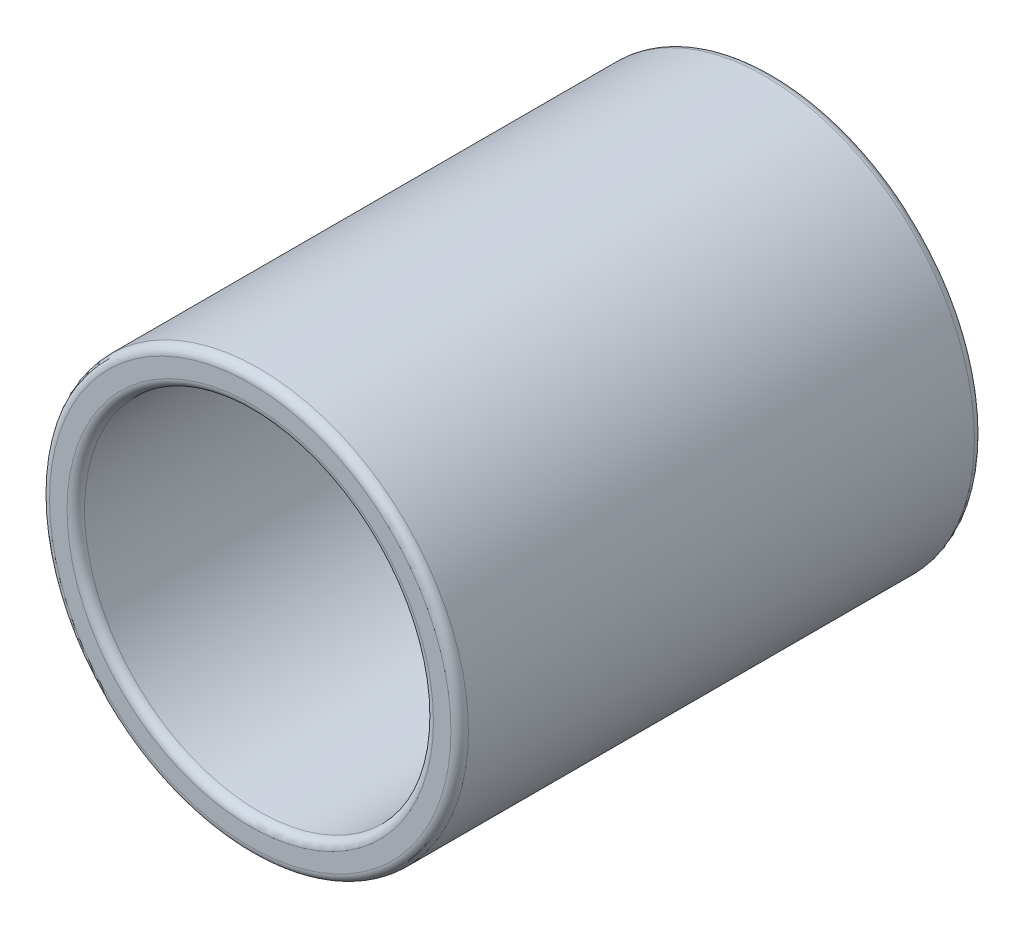
ISO-10303-21;
HEADER;
FILE_DESCRIPTION(('STEP AP214'),'2;1');
FILE_NAME('part.step','',(''),(''),'','','');
FILE_SCHEMA(('AUTOMOTIVE_DESIGN { 1 0 10303 214 1 1 1 1 }'));
ENDSEC;
DATA;
#1=APPLICATION_CONTEXT('core data for automotive mechanical design processes');
#2=APPLICATION_PROTOCOL_DEFINITION('international standard','automotive_design',2000,#1);
#3=PRODUCT_CONTEXT('',#1,'mechanical');
#4=PRODUCT('Part','Part','',(#3));
#5=PRODUCT_RELATED_PRODUCT_CATEGORY('part','',(#4));
#6=PRODUCT_DEFINITION_FORMATION('','',#4);
#7=PRODUCT_DEFINITION_CONTEXT('part definition',#1,'design');
#8=PRODUCT_DEFINITION('design','',#6,#7);
#9=PRODUCT_DEFINITION_SHAPE('','',#8);
#10=(LENGTH_UNIT() NAMED_UNIT(*) SI_UNIT(.MILLI.,.METRE.));
#11=(NAMED_UNIT(*) PLANE_ANGLE_UNIT() SI_UNIT($,.RADIAN.));
#12=(NAMED_UNIT(*) SI_UNIT($,.STERADIAN.) SOLID_ANGLE_UNIT());
#13=UNCERTAINTY_MEASURE_WITH_UNIT(LENGTH_MEASURE(1.E-05),#10,'distance_accuracy_value','');
#14=(GEOMETRIC_REPRESENTATION_CONTEXT(3) GLOBAL_UNCERTAINTY_ASSIGNED_CONTEXT((#13)) GLOBAL_UNIT_ASSIGNED_CONTEXT((#10,
#11,#12)) REPRESENTATION_CONTEXT('',''));
#15=CARTESIAN_POINT('',(0.,0.,0.));
#16=DIRECTION('',(0.,0.,1.));
#17=DIRECTION('',(1.,0.,0.));
#18=AXIS2_PLACEMENT_3D('',#15,#16,#17);
#19=CARTESIAN_POINT('',(0.,0.,30.));
#20=DIRECTION('',(0.,0.,1.));
#21=DIRECTION('',(1.,0.,0.));
#22=AXIS2_PLACEMENT_3D('',#19,#20,#21);
#23=PLANE('',#22);
#24=CARTESIAN_POINT('',(0.,0.,30.));
#25=DIRECTION('',(0.,0.,1.));
#26=DIRECTION('',(1.,0.,0.));
#27=AXIS2_PLACEMENT_3D('',#24,#25,#26);
#28=CIRCLE('',#27,10.5);
#29=CARTESIAN_POINT('',(10.5,0.,30.));
#30=VERTEX_POINT('',#29);
#31=EDGE_CURVE('E54',#30,#30,#28,.F.);
#32=ORIENTED_EDGE('',*,*,#31,.T.);
#33=EDGE_LOOP('',(#32));
#34=FACE_BOUND('',#33,.T.);
#35=CARTESIAN_POINT('',(0.,0.,30.));
#36=DIRECTION('',(0.,0.,1.));
#37=DIRECTION('',(1.,0.,0.));
#38=AXIS2_PLACEMENT_3D('',#35,#36,#37);
#39=CIRCLE('',#38,11.5);
#40=CARTESIAN_POINT('',(11.5,0.,30.));
#41=VERTEX_POINT('',#40);
#42=EDGE_CURVE('E59',#41,#41,#39,.T.);
#43=ORIENTED_EDGE('',*,*,#42,.T.);
#44=EDGE_LOOP('',(#43));
#45=FACE_BOUND('',#44,.T.);
#46=ADVANCED_FACE('F34',(#34,#45),#23,.T.);
#47=CARTESIAN_POINT('',(0.,0.,0.));
#48=DIRECTION('',(0.,0.,1.));
#49=DIRECTION('',(1.,0.,0.));
#50=AXIS2_PLACEMENT_3D('',#47,#48,#49);
#51=PLANE('',#50);
#52=CARTESIAN_POINT('',(0.,0.,0.));
#53=DIRECTION('',(0.,0.,1.));
#54=DIRECTION('',(1.,0.,0.));
#55=AXIS2_PLACEMENT_3D('',#52,#53,#54);
#56=CIRCLE('',#55,10.5);
#57=CARTESIAN_POINT('',(10.5,0.,0.));
#58=VERTEX_POINT('',#57);
#59=EDGE_CURVE('E10',#58,#58,#56,.T.);
#60=ORIENTED_EDGE('',*,*,#59,.T.);
#61=EDGE_LOOP('',(#60));
#62=FACE_BOUND('',#61,.T.);
#63=CARTESIAN_POINT('',(0.,0.,0.));
#64=DIRECTION('',(0.,0.,1.));
#65=DIRECTION('',(1.,0.,0.));
#66=AXIS2_PLACEMENT_3D('',#63,#64,#65);
#67=CIRCLE('',#66,11.5);
#68=CARTESIAN_POINT('',(11.5,0.,0.));
#69=VERTEX_POINT('',#68);
#70=EDGE_CURVE('E45',#69,#69,#67,.F.);
#71=ORIENTED_EDGE('',*,*,#70,.T.);
#72=EDGE_LOOP('',(#71));
#73=FACE_BOUND('',#72,.T.);
#74=ADVANCED_FACE('F86',(#62,#73),#51,.F.);
#75=CARTESIAN_POINT('',(0.,0.,30.));
#76=DIRECTION('',(0.,0.,-1.));
#77=DIRECTION('',(-1.,0.,0.));
#78=AXIS2_PLACEMENT_3D('',#75,#76,#77);
#79=CYLINDRICAL_SURFACE('',#78,12.);
#80=CARTESIAN_POINT('',(0.,0.,29.5));
#81=DIRECTION('',(0.,0.,1.));
#82=DIRECTION('',(1.,0.,0.));
#83=AXIS2_PLACEMENT_3D('',#80,#81,#82);
#84=CIRCLE('',#83,12.);
#85=CARTESIAN_POINT('',(12.,0.,29.5));
#86=VERTEX_POINT('',#85);
#87=EDGE_CURVE('E46',#86,#86,#84,.F.);
#88=ORIENTED_EDGE('',*,*,#87,.T.);
#89=EDGE_LOOP('',(#88));
#90=FACE_BOUND('',#89,.T.);
#91=CARTESIAN_POINT('',(0.,0.,0.5));
#92=DIRECTION('',(0.,0.,1.));
#93=DIRECTION('',(1.,0.,0.));
#94=AXIS2_PLACEMENT_3D('',#91,#92,#93);
#95=CIRCLE('',#94,12.);
#96=CARTESIAN_POINT('',(12.,0.,0.5));
#97=VERTEX_POINT('',#96);
#98=EDGE_CURVE('E49',#97,#97,#95,.T.);
#99=ORIENTED_EDGE('',*,*,#98,.T.);
#100=EDGE_LOOP('',(#99));
#101=FACE_BOUND('',#100,.T.);
#102=ADVANCED_FACE('F40',(#90,#101),#79,.T.);
#103=CARTESIAN_POINT('',(0.,0.,30.));
#104=DIRECTION('',(0.,0.,-1.));
#105=DIRECTION('',(-1.,0.,0.));
#106=AXIS2_PLACEMENT_3D('',#103,#104,#105);
#107=CYLINDRICAL_SURFACE('',#106,10.);
#108=CARTESIAN_POINT('',(0.,0.,29.5));
#109=DIRECTION('',(0.,0.,1.));
#110=DIRECTION('',(1.,0.,0.));
#111=AXIS2_PLACEMENT_3D('',#108,#109,#110);
#112=CIRCLE('',#111,10.);
#113=CARTESIAN_POINT('',(10.,0.,29.5));
#114=VERTEX_POINT('',#113);
#115=EDGE_CURVE('E63',#114,#114,#112,.T.);
#116=ORIENTED_EDGE('',*,*,#115,.T.);
#117=EDGE_LOOP('',(#116));
#118=FACE_BOUND('',#117,.T.);
#119=CARTESIAN_POINT('',(0.,0.,0.5));
#120=DIRECTION('',(0.,0.,1.));
#121=DIRECTION('',(1.,0.,0.));
#122=AXIS2_PLACEMENT_3D('',#119,#120,#121);
#123=CIRCLE('',#122,10.);
#124=CARTESIAN_POINT('',(10.,0.,0.5));
#125=VERTEX_POINT('',#124);
#126=EDGE_CURVE('E65',#125,#125,#123,.F.);
#127=ORIENTED_EDGE('',*,*,#126,.T.);
#128=EDGE_LOOP('',(#127));
#129=FACE_BOUND('',#128,.T.);
#130=ADVANCED_FACE('F66',(#118,#129),#107,.F.);
#131=CARTESIAN_POINT('',(0.,0.,29.5));
#132=DIRECTION('',(0.,0.,1.));
#133=DIRECTION('',(1.,0.,0.));
#134=AXIS2_PLACEMENT_3D('',#131,#132,#133);
#135=TOROIDAL_SURFACE('',#134,10.5,0.5);
#136=ORIENTED_EDGE('',*,*,#31,.F.);
#137=EDGE_LOOP('',(#136));
#138=FACE_BOUND('',#137,.T.);
#139=ORIENTED_EDGE('',*,*,#115,.F.);
#140=EDGE_LOOP('',(#139));
#141=FACE_BOUND('',#140,.T.);
#142=ADVANCED_FACE('F85',(#138,#141),#135,.T.);
#143=CARTESIAN_POINT('',(0.,0.,29.5));
#144=DIRECTION('',(0.,0.,1.));
#145=DIRECTION('',(1.,0.,0.));
#146=AXIS2_PLACEMENT_3D('',#143,#144,#145);
#147=TOROIDAL_SURFACE('',#146,11.5,0.5);
#148=ORIENTED_EDGE('',*,*,#87,.F.);
#149=EDGE_LOOP('',(#148));
#150=FACE_BOUND('',#149,.T.);
#151=ORIENTED_EDGE('',*,*,#42,.F.);
#152=EDGE_LOOP('',(#151));
#153=FACE_BOUND('',#152,.T.);
#154=ADVANCED_FACE('F73',(#150,#153),#147,.T.);
#155=CARTESIAN_POINT('',(0.,0.,0.5));
#156=DIRECTION('',(0.,0.,1.));
#157=DIRECTION('',(1.,0.,0.));
#158=AXIS2_PLACEMENT_3D('',#155,#156,#157);
#159=TOROIDAL_SURFACE('',#158,10.5,0.5);
#160=ORIENTED_EDGE('',*,*,#126,.F.);
#161=EDGE_LOOP('',(#160));
#162=FACE_BOUND('',#161,.T.);
#163=ORIENTED_EDGE('',*,*,#59,.F.);
#164=EDGE_LOOP('',(#163));
#165=FACE_BOUND('',#164,.T.);
#166=ADVANCED_FACE('F68',(#162,#165),#159,.T.);
#167=CARTESIAN_POINT('',(0.,0.,0.5));
#168=DIRECTION('',(0.,0.,1.));
#169=DIRECTION('',(1.,0.,0.));
#170=AXIS2_PLACEMENT_3D('',#167,#168,#169);
#171=TOROIDAL_SURFACE('',#170,11.5,0.5);
#172=ORIENTED_EDGE('',*,*,#70,.F.);
#173=EDGE_LOOP('',(#172));
#174=FACE_BOUND('',#173,.T.);
#175=ORIENTED_EDGE('',*,*,#98,.F.);
#176=EDGE_LOOP('',(#175));
#177=FACE_BOUND('',#176,.T.);
#178=ADVANCED_FACE('F75',(#174,#177),#171,.T.);
#179=CLOSED_SHELL('',(#46,#74,#102,#130,#142,#154,#166,#178));
#180=MANIFOLD_SOLID_BREP('B2',#179);
#181=ADVANCED_BREP_SHAPE_REPRESENTATION('',(#18,#180),#14);
#182=SHAPE_DEFINITION_REPRESENTATION(#9,#181);
ENDSEC;
END-ISO-10303-21;
